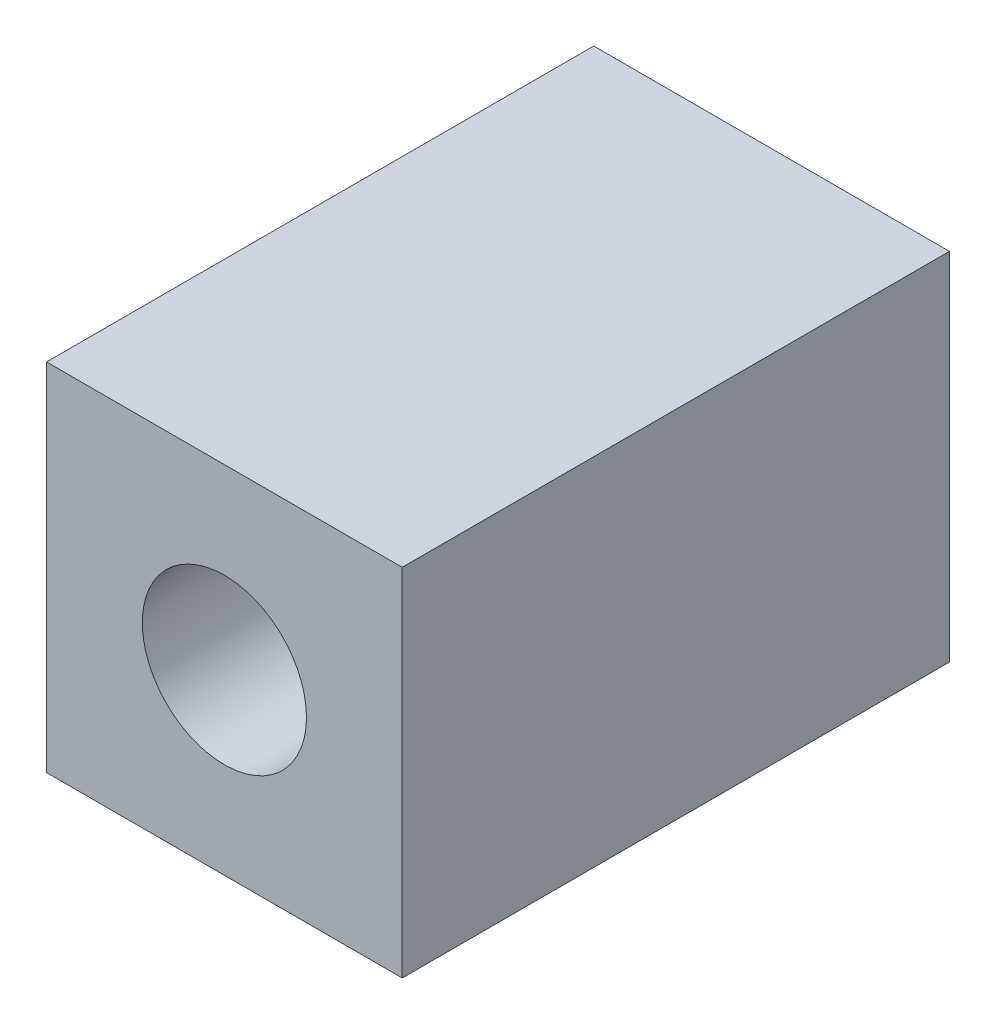
ISO-10303-21;
HEADER;
FILE_DESCRIPTION(('STEP AP214'),'2;1');
FILE_NAME('part.step','',(''),(''),'','','');
FILE_SCHEMA(('AUTOMOTIVE_DESIGN { 1 0 10303 214 1 1 1 1 }'));
ENDSEC;
DATA;
#1=APPLICATION_CONTEXT('core data for automotive mechanical design processes');
#2=APPLICATION_PROTOCOL_DEFINITION('international standard','automotive_design',2000,#1);
#3=PRODUCT_CONTEXT('',#1,'mechanical');
#4=PRODUCT('Part','Part','',(#3));
#5=PRODUCT_RELATED_PRODUCT_CATEGORY('part','',(#4));
#6=PRODUCT_DEFINITION_FORMATION('','',#4);
#7=PRODUCT_DEFINITION_CONTEXT('part definition',#1,'design');
#8=PRODUCT_DEFINITION('design','',#6,#7);
#9=PRODUCT_DEFINITION_SHAPE('','',#8);
#10=(LENGTH_UNIT() NAMED_UNIT(*) SI_UNIT(.MILLI.,.METRE.));
#11=(NAMED_UNIT(*) PLANE_ANGLE_UNIT() SI_UNIT($,.RADIAN.));
#12=(NAMED_UNIT(*) SI_UNIT($,.STERADIAN.) SOLID_ANGLE_UNIT());
#13=UNCERTAINTY_MEASURE_WITH_UNIT(LENGTH_MEASURE(1.E-05),#10,'distance_accuracy_value','');
#14=(GEOMETRIC_REPRESENTATION_CONTEXT(3) GLOBAL_UNCERTAINTY_ASSIGNED_CONTEXT((#13)) GLOBAL_UNIT_ASSIGNED_CONTEXT((#10,
#11,#12)) REPRESENTATION_CONTEXT('',''));
#15=CARTESIAN_POINT('',(0.,0.,0.));
#16=DIRECTION('',(0.,0.,1.));
#17=DIRECTION('',(1.,0.,0.));
#18=AXIS2_PLACEMENT_3D('',#15,#16,#17);
#19=CARTESIAN_POINT('',(0.,0.,200.));
#20=DIRECTION('',(0.,0.,1.));
#21=DIRECTION('',(1.,0.,0.));
#22=AXIS2_PLACEMENT_3D('',#19,#20,#21);
#23=PLANE('',#22);
#24=DIRECTION('',(0.,-1.,0.));
#25=VECTOR('',#24,1.);
#26=CARTESIAN_POINT('',(-65.,65.,200.));
#27=LINE('',#26,#25);
#28=CARTESIAN_POINT('',(-65.,65.,200.));
#29=VERTEX_POINT('',#28);
#30=CARTESIAN_POINT('',(-65.,-65.,200.));
#31=VERTEX_POINT('',#30);
#32=EDGE_CURVE('E84',#29,#31,#27,.T.);
#33=ORIENTED_EDGE('',*,*,#32,.T.);
#34=DIRECTION('',(1.,0.,0.));
#35=VECTOR('',#34,1.);
#36=CARTESIAN_POINT('',(-65.,-65.,200.));
#37=LINE('',#36,#35);
#38=CARTESIAN_POINT('',(65.,-65.,200.));
#39=VERTEX_POINT('',#38);
#40=EDGE_CURVE('E79',#31,#39,#37,.T.);
#41=ORIENTED_EDGE('',*,*,#40,.T.);
#42=DIRECTION('',(0.,1.,0.));
#43=VECTOR('',#42,1.);
#44=CARTESIAN_POINT('',(65.,65.,200.));
#45=LINE('',#44,#43);
#46=CARTESIAN_POINT('',(65.,65.,200.));
#47=VERTEX_POINT('',#46);
#48=EDGE_CURVE('E82',#39,#47,#45,.T.);
#49=ORIENTED_EDGE('',*,*,#48,.T.);
#50=DIRECTION('',(-1.,0.,0.));
#51=VECTOR('',#50,1.);
#52=CARTESIAN_POINT('',(-65.,65.,200.));
#53=LINE('',#52,#51);
#54=EDGE_CURVE('E49',#47,#29,#53,.T.);
#55=ORIENTED_EDGE('',*,*,#54,.T.);
#56=EDGE_LOOP('',(#33,#41,#49,#55));
#57=FACE_BOUND('',#56,.T.);
#58=CARTESIAN_POINT('',(0.,0.,200.));
#59=DIRECTION('',(0.,0.,1.));
#60=DIRECTION('',(1.,0.,0.));
#61=AXIS2_PLACEMENT_3D('',#58,#59,#60);
#62=CIRCLE('',#61,30.);
#63=CARTESIAN_POINT('',(30.,0.,200.));
#64=VERTEX_POINT('',#63);
#65=EDGE_CURVE('E99',#64,#64,#62,.T.);
#66=ORIENTED_EDGE('',*,*,#65,.F.);
#67=EDGE_LOOP('',(#66));
#68=FACE_BOUND('',#67,.T.);
#69=ADVANCED_FACE('F32',(#57,#68),#23,.T.);
#70=CARTESIAN_POINT('',(0.,0.,0.));
#71=DIRECTION('',(0.,0.,1.));
#72=DIRECTION('',(1.,0.,0.));
#73=AXIS2_PLACEMENT_3D('',#70,#71,#72);
#74=PLANE('',#73);
#75=DIRECTION('',(0.,-1.,0.));
#76=VECTOR('',#75,1.);
#77=CARTESIAN_POINT('',(-65.,65.,0.));
#78=LINE('',#77,#76);
#79=CARTESIAN_POINT('',(-65.,65.,0.));
#80=VERTEX_POINT('',#79);
#81=CARTESIAN_POINT('',(-65.,-65.,0.));
#82=VERTEX_POINT('',#81);
#83=EDGE_CURVE('E96',#80,#82,#78,.T.);
#84=ORIENTED_EDGE('',*,*,#83,.F.);
#85=DIRECTION('',(-1.,0.,0.));
#86=VECTOR('',#85,1.);
#87=CARTESIAN_POINT('',(-65.,65.,0.));
#88=LINE('',#87,#86);
#89=CARTESIAN_POINT('',(65.,65.,0.));
#90=VERTEX_POINT('',#89);
#91=EDGE_CURVE('E72',#90,#80,#88,.T.);
#92=ORIENTED_EDGE('',*,*,#91,.F.);
#93=DIRECTION('',(0.,1.,0.));
#94=VECTOR('',#93,1.);
#95=CARTESIAN_POINT('',(65.,65.,0.));
#96=LINE('',#95,#94);
#97=CARTESIAN_POINT('',(65.,-65.,0.));
#98=VERTEX_POINT('',#97);
#99=EDGE_CURVE('E66',#98,#90,#96,.T.);
#100=ORIENTED_EDGE('',*,*,#99,.F.);
#101=DIRECTION('',(1.,0.,0.));
#102=VECTOR('',#101,1.);
#103=CARTESIAN_POINT('',(-65.,-65.,0.));
#104=LINE('',#103,#102);
#105=EDGE_CURVE('E88',#82,#98,#104,.T.);
#106=ORIENTED_EDGE('',*,*,#105,.F.);
#107=EDGE_LOOP('',(#84,#92,#100,#106));
#108=FACE_BOUND('',#107,.T.);
#109=CARTESIAN_POINT('',(0.,0.,0.));
#110=DIRECTION('',(0.,0.,1.));
#111=DIRECTION('',(1.,0.,0.));
#112=AXIS2_PLACEMENT_3D('',#109,#110,#111);
#113=CIRCLE('',#112,30.);
#114=CARTESIAN_POINT('',(30.,0.,0.));
#115=VERTEX_POINT('',#114);
#116=EDGE_CURVE('E111',#115,#115,#113,.T.);
#117=ORIENTED_EDGE('',*,*,#116,.T.);
#118=EDGE_LOOP('',(#117));
#119=FACE_BOUND('',#118,.T.);
#120=ADVANCED_FACE('F107',(#108,#119),#74,.F.);
#121=CARTESIAN_POINT('',(-65.,65.,200.));
#122=DIRECTION('',(1.,0.,0.));
#123=DIRECTION('',(0.,0.,-1.));
#124=AXIS2_PLACEMENT_3D('',#121,#122,#123);
#125=PLANE('',#124);
#126=ORIENTED_EDGE('',*,*,#83,.T.);
#127=DIRECTION('',(0.,0.,-1.));
#128=VECTOR('',#127,1.);
#129=CARTESIAN_POINT('',(-65.,-65.,200.));
#130=LINE('',#129,#128);
#131=EDGE_CURVE('E11',#31,#82,#130,.T.);
#132=ORIENTED_EDGE('',*,*,#131,.F.);
#133=ORIENTED_EDGE('',*,*,#32,.F.);
#134=DIRECTION('',(0.,0.,-1.));
#135=VECTOR('',#134,1.);
#136=CARTESIAN_POINT('',(-65.,65.,200.));
#137=LINE('',#136,#135);
#138=EDGE_CURVE('E92',#29,#80,#137,.T.);
#139=ORIENTED_EDGE('',*,*,#138,.T.);
#140=EDGE_LOOP('',(#126,#132,#133,#139));
#141=FACE_BOUND('',#140,.T.);
#142=ADVANCED_FACE('F34',(#141),#125,.F.);
#143=CARTESIAN_POINT('',(-65.,-65.,200.));
#144=DIRECTION('',(0.,1.,0.));
#145=DIRECTION('',(0.,0.,1.));
#146=AXIS2_PLACEMENT_3D('',#143,#144,#145);
#147=PLANE('',#146);
#148=ORIENTED_EDGE('',*,*,#105,.T.);
#149=DIRECTION('',(0.,0.,-1.));
#150=VECTOR('',#149,1.);
#151=CARTESIAN_POINT('',(65.,-65.,200.));
#152=LINE('',#151,#150);
#153=EDGE_CURVE('E41',#39,#98,#152,.T.);
#154=ORIENTED_EDGE('',*,*,#153,.F.);
#155=ORIENTED_EDGE('',*,*,#40,.F.);
#156=ORIENTED_EDGE('',*,*,#131,.T.);
#157=EDGE_LOOP('',(#148,#154,#155,#156));
#158=FACE_BOUND('',#157,.T.);
#159=ADVANCED_FACE('F87',(#158),#147,.F.);
#160=CARTESIAN_POINT('',(65.,65.,200.));
#161=DIRECTION('',(-1.,0.,0.));
#162=DIRECTION('',(0.,0.,1.));
#163=AXIS2_PLACEMENT_3D('',#160,#161,#162);
#164=PLANE('',#163);
#165=ORIENTED_EDGE('',*,*,#99,.T.);
#166=DIRECTION('',(0.,0.,-1.));
#167=VECTOR('',#166,1.);
#168=CARTESIAN_POINT('',(65.,65.,200.));
#169=LINE('',#168,#167);
#170=EDGE_CURVE('E89',#47,#90,#169,.T.);
#171=ORIENTED_EDGE('',*,*,#170,.F.);
#172=ORIENTED_EDGE('',*,*,#48,.F.);
#173=ORIENTED_EDGE('',*,*,#153,.T.);
#174=EDGE_LOOP('',(#165,#171,#172,#173));
#175=FACE_BOUND('',#174,.T.);
#176=ADVANCED_FACE('F90',(#175),#164,.F.);
#177=CARTESIAN_POINT('',(-65.,65.,200.));
#178=DIRECTION('',(0.,-1.,0.));
#179=DIRECTION('',(0.,0.,-1.));
#180=AXIS2_PLACEMENT_3D('',#177,#178,#179);
#181=PLANE('',#180);
#182=ORIENTED_EDGE('',*,*,#91,.T.);
#183=ORIENTED_EDGE('',*,*,#138,.F.);
#184=ORIENTED_EDGE('',*,*,#54,.F.);
#185=ORIENTED_EDGE('',*,*,#170,.T.);
#186=EDGE_LOOP('',(#182,#183,#184,#185));
#187=FACE_BOUND('',#186,.T.);
#188=ADVANCED_FACE('F104',(#187),#181,.F.);
#189=CARTESIAN_POINT('',(0.,0.,200.));
#190=DIRECTION('',(0.,0.,-1.));
#191=DIRECTION('',(-1.,0.,0.));
#192=AXIS2_PLACEMENT_3D('',#189,#190,#191);
#193=CYLINDRICAL_SURFACE('',#192,30.);
#194=ORIENTED_EDGE('',*,*,#65,.T.);
#195=EDGE_LOOP('',(#194));
#196=FACE_BOUND('',#195,.T.);
#197=ORIENTED_EDGE('',*,*,#116,.F.);
#198=EDGE_LOOP('',(#197));
#199=FACE_BOUND('',#198,.T.);
#200=ADVANCED_FACE('F117',(#196,#199),#193,.F.);
#201=CLOSED_SHELL('',(#69,#120,#142,#159,#176,#188,#200));
#202=MANIFOLD_SOLID_BREP('B2',#201);
#203=ADVANCED_BREP_SHAPE_REPRESENTATION('',(#18,#202),#14);
#204=SHAPE_DEFINITION_REPRESENTATION(#9,#203);
ENDSEC;
END-ISO-10303-21;
